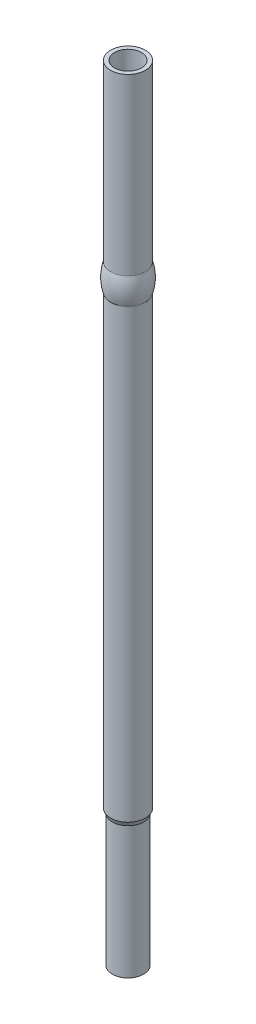
ISO-10303-21;
HEADER;
FILE_DESCRIPTION(('STEP AP214'),'2;1');
FILE_NAME('part.step','',(''),(''),'','','');
FILE_SCHEMA(('AUTOMOTIVE_DESIGN { 1 0 10303 214 1 1 1 1 }'));
ENDSEC;
DATA;
#1=APPLICATION_CONTEXT('core data for automotive mechanical design processes');
#2=APPLICATION_PROTOCOL_DEFINITION('international standard','automotive_design',2000,#1);
#3=PRODUCT_CONTEXT('',#1,'mechanical');
#4=PRODUCT('Part','Part','',(#3));
#5=PRODUCT_RELATED_PRODUCT_CATEGORY('part','',(#4));
#6=PRODUCT_DEFINITION_FORMATION('','',#4);
#7=PRODUCT_DEFINITION_CONTEXT('part definition',#1,'design');
#8=PRODUCT_DEFINITION('design','',#6,#7);
#9=PRODUCT_DEFINITION_SHAPE('','',#8);
#10=(LENGTH_UNIT() NAMED_UNIT(*) SI_UNIT(.MILLI.,.METRE.));
#11=(NAMED_UNIT(*) PLANE_ANGLE_UNIT() SI_UNIT($,.RADIAN.));
#12=(NAMED_UNIT(*) SI_UNIT($,.STERADIAN.) SOLID_ANGLE_UNIT());
#13=UNCERTAINTY_MEASURE_WITH_UNIT(LENGTH_MEASURE(1.E-05),#10,'distance_accuracy_value','');
#14=(GEOMETRIC_REPRESENTATION_CONTEXT(3) GLOBAL_UNCERTAINTY_ASSIGNED_CONTEXT((#13)) GLOBAL_UNIT_ASSIGNED_CONTEXT((#10,
#11,#12)) REPRESENTATION_CONTEXT('',''));
#15=CARTESIAN_POINT('',(0.,0.,0.));
#16=DIRECTION('',(0.,0.,1.));
#17=DIRECTION('',(1.,0.,0.));
#18=AXIS2_PLACEMENT_3D('',#15,#16,#17);
#19=CARTESIAN_POINT('',(0.,0.,-0.66));
#20=DIRECTION('',(0.,-1.,0.));
#21=DIRECTION('',(0.,0.,-1.));
#22=AXIS2_PLACEMENT_3D('',#19,#20,#21);
#23=PLANE('',#22);
#24=CARTESIAN_POINT('',(0.,0.,0.));
#25=DIRECTION('',(0.,1.,0.));
#26=DIRECTION('',(0.,0.,1.));
#27=AXIS2_PLACEMENT_3D('',#24,#25,#26);
#28=CIRCLE('',#27,0.51);
#29=CARTESIAN_POINT('',(0.,0.,0.51));
#30=VERTEX_POINT('',#29);
#31=EDGE_CURVE('E67',#30,#30,#28,.T.);
#32=ORIENTED_EDGE('',*,*,#31,.F.);
#33=EDGE_LOOP('',(#32));
#34=FACE_BOUND('',#33,.T.);
#35=CARTESIAN_POINT('',(0.,0.,0.));
#36=DIRECTION('',(0.,1.,0.));
#37=DIRECTION('',(0.,0.,1.));
#38=AXIS2_PLACEMENT_3D('',#35,#36,#37);
#39=CIRCLE('',#38,0.66);
#40=CARTESIAN_POINT('',(0.,0.,0.66));
#41=VERTEX_POINT('',#40);
#42=EDGE_CURVE('E10',#41,#41,#39,.T.);
#43=ORIENTED_EDGE('',*,*,#42,.T.);
#44=EDGE_LOOP('',(#43));
#45=FACE_BOUND('',#44,.T.);
#46=ADVANCED_FACE('F33',(#34,#45),#23,.F.);
#47=CARTESIAN_POINT('',(0.,-18.54,0.));
#48=DIRECTION('',(0.,1.,0.));
#49=DIRECTION('',(0.,0.,1.));
#50=AXIS2_PLACEMENT_3D('',#47,#48,#49);
#51=CYLINDRICAL_SURFACE('',#50,0.66);
#52=ORIENTED_EDGE('',*,*,#42,.F.);
#53=EDGE_LOOP('',(#52));
#54=FACE_BOUND('',#53,.T.);
#55=CARTESIAN_POINT('',(0.,-6.62,0.));
#56=DIRECTION('',(0.,1.,0.));
#57=DIRECTION('',(0.,0.,1.));
#58=AXIS2_PLACEMENT_3D('',#55,#56,#57);
#59=CIRCLE('',#58,0.66);
#60=CARTESIAN_POINT('',(0.,-6.62,0.66));
#61=VERTEX_POINT('',#60);
#62=EDGE_CURVE('E39',#61,#61,#59,.T.);
#63=ORIENTED_EDGE('',*,*,#62,.T.);
#64=EDGE_LOOP('',(#63));
#65=FACE_BOUND('',#64,.T.);
#66=ADVANCED_FACE('F74',(#54,#65),#51,.T.);
#67=CARTESIAN_POINT('',(0.,-7.12,0.));
#68=DIRECTION('',(0.,1.,0.));
#69=DIRECTION('',(0.,0.,1.));
#70=AXIS2_PLACEMENT_3D('',#67,#68,#69);
#71=DEGENERATE_TOROIDAL_SURFACE('',#70,0.96916666666665,1.70416666666665,.F.);
#72=ORIENTED_EDGE('',*,*,#62,.F.);
#73=EDGE_LOOP('',(#72));
#74=FACE_BOUND('',#73,.T.);
#75=CARTESIAN_POINT('',(0.,-7.62,0.));
#76=DIRECTION('',(0.,1.,0.));
#77=DIRECTION('',(0.,0.,1.));
#78=AXIS2_PLACEMENT_3D('',#75,#76,#77);
#79=CIRCLE('',#78,0.66);
#80=CARTESIAN_POINT('',(0.,-7.62,0.66));
#81=VERTEX_POINT('',#80);
#82=EDGE_CURVE('E43',#81,#81,#79,.T.);
#83=ORIENTED_EDGE('',*,*,#82,.T.);
#84=EDGE_LOOP('',(#83));
#85=FACE_BOUND('',#84,.T.);
#86=ADVANCED_FACE('F78',(#74,#85),#71,.F.);
#87=CARTESIAN_POINT('',(0.,-18.54,0.));
#88=DIRECTION('',(0.,1.,0.));
#89=DIRECTION('',(0.,0.,1.));
#90=AXIS2_PLACEMENT_3D('',#87,#88,#89);
#91=CYLINDRICAL_SURFACE('',#90,0.66);
#92=ORIENTED_EDGE('',*,*,#82,.F.);
#93=EDGE_LOOP('',(#92));
#94=FACE_BOUND('',#93,.T.);
#95=CARTESIAN_POINT('',(0.,-24.56,0.));
#96=DIRECTION('',(0.,1.,0.));
#97=DIRECTION('',(0.,0.,1.));
#98=AXIS2_PLACEMENT_3D('',#95,#96,#97);
#99=CIRCLE('',#98,0.66);
#100=CARTESIAN_POINT('',(0.,-24.56,0.66));
#101=VERTEX_POINT('',#100);
#102=EDGE_CURVE('E47',#101,#101,#99,.T.);
#103=ORIENTED_EDGE('',*,*,#102,.T.);
#104=EDGE_LOOP('',(#103));
#105=FACE_BOUND('',#104,.T.);
#106=ADVANCED_FACE('F83',(#94,#105),#91,.T.);
#107=CARTESIAN_POINT('',(0.,-24.72,0.));
#108=DIRECTION('',(0.,1.,0.));
#109=DIRECTION('',(0.,0.,1.));
#110=AXIS2_PLACEMENT_3D('',#107,#108,#109);
#111=CONICAL_SURFACE('',#110,0.595,0.385882669398081);
#112=ORIENTED_EDGE('',*,*,#102,.F.);
#113=EDGE_LOOP('',(#112));
#114=FACE_BOUND('',#113,.T.);
#115=CARTESIAN_POINT('',(0.,-24.72,0.));
#116=DIRECTION('',(0.,1.,0.));
#117=DIRECTION('',(0.,0.,1.));
#118=AXIS2_PLACEMENT_3D('',#115,#116,#117);
#119=CIRCLE('',#118,0.595);
#120=CARTESIAN_POINT('',(0.,-24.72,0.595));
#121=VERTEX_POINT('',#120);
#122=EDGE_CURVE('E52',#121,#121,#119,.T.);
#123=ORIENTED_EDGE('',*,*,#122,.T.);
#124=EDGE_LOOP('',(#123));
#125=FACE_BOUND('',#124,.T.);
#126=ADVANCED_FACE('F89',(#114,#125),#111,.T.);
#127=CARTESIAN_POINT('',(0.,-18.54,0.));
#128=DIRECTION('',(0.,1.,0.));
#129=DIRECTION('',(0.,0.,1.));
#130=AXIS2_PLACEMENT_3D('',#127,#128,#129);
#131=CYLINDRICAL_SURFACE('',#130,0.595);
#132=ORIENTED_EDGE('',*,*,#122,.F.);
#133=EDGE_LOOP('',(#132));
#134=FACE_BOUND('',#133,.T.);
#135=CARTESIAN_POINT('',(0.,-29.72,0.));
#136=DIRECTION('',(0.,1.,0.));
#137=DIRECTION('',(0.,0.,1.));
#138=AXIS2_PLACEMENT_3D('',#135,#136,#137);
#139=CIRCLE('',#138,0.595);
#140=CARTESIAN_POINT('',(0.,-29.72,0.595));
#141=VERTEX_POINT('',#140);
#142=EDGE_CURVE('E55',#141,#141,#139,.T.);
#143=ORIENTED_EDGE('',*,*,#142,.T.);
#144=EDGE_LOOP('',(#143));
#145=FACE_BOUND('',#144,.T.);
#146=ADVANCED_FACE('F93',(#134,#145),#131,.T.);
#147=CARTESIAN_POINT('',(0.,-29.72,-0.455000000000001));
#148=DIRECTION('',(0.,1.,0.));
#149=DIRECTION('',(0.,0.,1.));
#150=AXIS2_PLACEMENT_3D('',#147,#148,#149);
#151=PLANE('',#150);
#152=ORIENTED_EDGE('',*,*,#142,.F.);
#153=EDGE_LOOP('',(#152));
#154=FACE_BOUND('',#153,.T.);
#155=CARTESIAN_POINT('',(0.,-29.72,0.));
#156=DIRECTION('',(0.,1.,0.));
#157=DIRECTION('',(0.,0.,1.));
#158=AXIS2_PLACEMENT_3D('',#155,#156,#157);
#159=CIRCLE('',#158,0.455000000000001);
#160=CARTESIAN_POINT('',(0.,-29.72,0.455000000000001));
#161=VERTEX_POINT('',#160);
#162=EDGE_CURVE('E58',#161,#161,#159,.T.);
#163=ORIENTED_EDGE('',*,*,#162,.T.);
#164=EDGE_LOOP('',(#163));
#165=FACE_BOUND('',#164,.T.);
#166=ADVANCED_FACE('F97',(#154,#165),#151,.F.);
#167=CARTESIAN_POINT('',(0.,-18.54,0.));
#168=DIRECTION('',(0.,1.,0.));
#169=DIRECTION('',(0.,0.,1.));
#170=AXIS2_PLACEMENT_3D('',#167,#168,#169);
#171=CYLINDRICAL_SURFACE('',#170,0.455);
#172=ORIENTED_EDGE('',*,*,#162,.F.);
#173=EDGE_LOOP('',(#172));
#174=FACE_BOUND('',#173,.T.);
#175=CARTESIAN_POINT('',(0.,-24.72,0.));
#176=DIRECTION('',(0.,1.,0.));
#177=DIRECTION('',(0.,0.,1.));
#178=AXIS2_PLACEMENT_3D('',#175,#176,#177);
#179=CIRCLE('',#178,0.455);
#180=CARTESIAN_POINT('',(0.,-24.72,0.455));
#181=VERTEX_POINT('',#180);
#182=EDGE_CURVE('E61',#181,#181,#179,.T.);
#183=ORIENTED_EDGE('',*,*,#182,.T.);
#184=EDGE_LOOP('',(#183));
#185=FACE_BOUND('',#184,.T.);
#186=ADVANCED_FACE('F101',(#174,#185),#171,.F.);
#187=CARTESIAN_POINT('',(0.,-24.72,0.));
#188=DIRECTION('',(0.,1.,0.));
#189=DIRECTION('',(0.,0.,1.));
#190=AXIS2_PLACEMENT_3D('',#187,#188,#189);
#191=PLANE('',#190);
#192=ORIENTED_EDGE('',*,*,#182,.F.);
#193=EDGE_LOOP('',(#192));
#194=FACE_BOUND('',#193,.T.);
#195=ADVANCED_FACE('F105',(#194),#191,.F.);
#196=CARTESIAN_POINT('',(0.,-18.54,-0.510000000000002));
#197=DIRECTION('',(0.,-1.,0.));
#198=DIRECTION('',(0.,0.,-1.));
#199=AXIS2_PLACEMENT_3D('',#196,#197,#198);
#200=PLANE('',#199);
#201=CARTESIAN_POINT('',(0.,-18.54,0.));
#202=DIRECTION('',(0.,1.,0.));
#203=DIRECTION('',(0.,0.,1.));
#204=AXIS2_PLACEMENT_3D('',#201,#202,#203);
#205=CIRCLE('',#204,0.510000000000002);
#206=CARTESIAN_POINT('',(0.,-18.54,0.510000000000002));
#207=VERTEX_POINT('',#206);
#208=EDGE_CURVE('E64',#207,#207,#205,.T.);
#209=ORIENTED_EDGE('',*,*,#208,.T.);
#210=EDGE_LOOP('',(#209));
#211=FACE_BOUND('',#210,.T.);
#212=ADVANCED_FACE('F109',(#211),#200,.F.);
#213=CARTESIAN_POINT('',(0.,-18.54,0.));
#214=DIRECTION('',(0.,1.,0.));
#215=DIRECTION('',(0.,0.,1.));
#216=AXIS2_PLACEMENT_3D('',#213,#214,#215);
#217=CYLINDRICAL_SURFACE('',#216,0.510000000000001);
#218=ORIENTED_EDGE('',*,*,#208,.F.);
#219=EDGE_LOOP('',(#218));
#220=FACE_BOUND('',#219,.T.);
#221=ORIENTED_EDGE('',*,*,#31,.T.);
#222=EDGE_LOOP('',(#221));
#223=FACE_BOUND('',#222,.T.);
#224=ADVANCED_FACE('F71',(#220,#223),#217,.F.);
#225=CLOSED_SHELL('',(#46,#66,#86,#106,#126,#146,#166,#186,#195,#212,#224));
#226=MANIFOLD_SOLID_BREP('B2',#225);
#227=ADVANCED_BREP_SHAPE_REPRESENTATION('',(#18,#226),#14);
#228=SHAPE_DEFINITION_REPRESENTATION(#9,#227);
ENDSEC;
END-ISO-10303-21;
